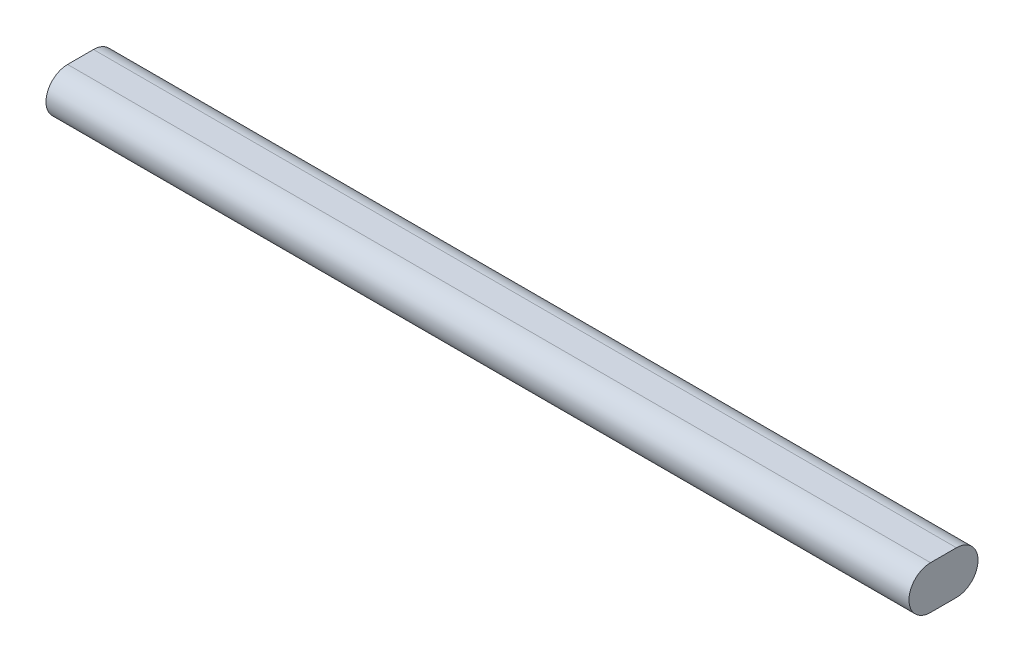
ISO-10303-21;
HEADER;
FILE_DESCRIPTION(('STEP AP214'),'2;1');
FILE_NAME('part.step','',(''),(''),'','','');
FILE_SCHEMA(('AUTOMOTIVE_DESIGN { 1 0 10303 214 1 1 1 1 }'));
ENDSEC;
DATA;
#1=APPLICATION_CONTEXT('core data for automotive mechanical design processes');
#2=APPLICATION_PROTOCOL_DEFINITION('international standard','automotive_design',2000,#1);
#3=PRODUCT_CONTEXT('',#1,'mechanical');
#4=PRODUCT('Part','Part','',(#3));
#5=PRODUCT_RELATED_PRODUCT_CATEGORY('part','',(#4));
#6=PRODUCT_DEFINITION_FORMATION('','',#4);
#7=PRODUCT_DEFINITION_CONTEXT('part definition',#1,'design');
#8=PRODUCT_DEFINITION('design','',#6,#7);
#9=PRODUCT_DEFINITION_SHAPE('','',#8);
#10=(LENGTH_UNIT() NAMED_UNIT(*) SI_UNIT(.MILLI.,.METRE.));
#11=(NAMED_UNIT(*) PLANE_ANGLE_UNIT() SI_UNIT($,.RADIAN.));
#12=(NAMED_UNIT(*) SI_UNIT($,.STERADIAN.) SOLID_ANGLE_UNIT());
#13=UNCERTAINTY_MEASURE_WITH_UNIT(LENGTH_MEASURE(1.E-05),#10,'distance_accuracy_value','');
#14=(GEOMETRIC_REPRESENTATION_CONTEXT(3) GLOBAL_UNCERTAINTY_ASSIGNED_CONTEXT((#13)) GLOBAL_UNIT_ASSIGNED_CONTEXT((#10,
#11,#12)) REPRESENTATION_CONTEXT('',''));
#15=CARTESIAN_POINT('',(0.,0.,0.));
#16=DIRECTION('',(0.,0.,1.));
#17=DIRECTION('',(1.,0.,0.));
#18=AXIS2_PLACEMENT_3D('',#15,#16,#17);
#19=CARTESIAN_POINT('',(500.,0.,0.));
#20=DIRECTION('',(-1.,0.,0.));
#21=DIRECTION('',(0.,0.,1.));
#22=AXIS2_PLACEMENT_3D('',#19,#20,#21);
#23=CYLINDRICAL_SURFACE('',#22,12.5);
#24=CARTESIAN_POINT('',(0.,0.,0.));
#25=DIRECTION('',(1.,0.,0.));
#26=DIRECTION('',(0.,0.,-1.));
#27=AXIS2_PLACEMENT_3D('',#24,#25,#26);
#28=CIRCLE('',#27,12.5);
#29=CARTESIAN_POINT('',(0.,12.5,0.));
#30=VERTEX_POINT('',#29);
#31=CARTESIAN_POINT('',(0.,-12.5,0.));
#32=VERTEX_POINT('',#31);
#33=EDGE_CURVE('E107',#30,#32,#28,.T.);
#34=ORIENTED_EDGE('',*,*,#33,.T.);
#35=DIRECTION('',(-1.,0.,0.));
#36=VECTOR('',#35,1.);
#37=CARTESIAN_POINT('',(500.,-12.5,0.));
#38=LINE('',#37,#36);
#39=CARTESIAN_POINT('',(500.,-12.5,0.));
#40=VERTEX_POINT('',#39);
#41=EDGE_CURVE('E11',#40,#32,#38,.T.);
#42=ORIENTED_EDGE('',*,*,#41,.F.);
#43=CARTESIAN_POINT('',(500.,0.,0.));
#44=DIRECTION('',(1.,0.,0.));
#45=DIRECTION('',(0.,0.,-1.));
#46=AXIS2_PLACEMENT_3D('',#43,#44,#45);
#47=CIRCLE('',#46,12.5);
#48=CARTESIAN_POINT('',(500.,12.5,0.));
#49=VERTEX_POINT('',#48);
#50=EDGE_CURVE('E91',#49,#40,#47,.T.);
#51=ORIENTED_EDGE('',*,*,#50,.F.);
#52=DIRECTION('',(-1.,0.,0.));
#53=VECTOR('',#52,1.);
#54=CARTESIAN_POINT('',(500.,12.5,0.));
#55=LINE('',#54,#53);
#56=EDGE_CURVE('E103',#49,#30,#55,.T.);
#57=ORIENTED_EDGE('',*,*,#56,.T.);
#58=EDGE_LOOP('',(#34,#42,#51,#57));
#59=FACE_BOUND('',#58,.T.);
#60=ADVANCED_FACE('F39',(#59),#23,.T.);
#61=CARTESIAN_POINT('',(500.,-12.5,0.));
#62=DIRECTION('',(0.,1.,0.));
#63=DIRECTION('',(0.,0.,1.));
#64=AXIS2_PLACEMENT_3D('',#61,#62,#63);
#65=PLANE('',#64);
#66=DIRECTION('',(0.,0.,-1.));
#67=VECTOR('',#66,1.);
#68=CARTESIAN_POINT('',(0.,-12.5,0.));
#69=LINE('',#68,#67);
#70=CARTESIAN_POINT('',(0.,-12.5,-15.));
#71=VERTEX_POINT('',#70);
#72=EDGE_CURVE('E96',#32,#71,#69,.T.);
#73=ORIENTED_EDGE('',*,*,#72,.T.);
#74=DIRECTION('',(-1.,0.,0.));
#75=VECTOR('',#74,1.);
#76=CARTESIAN_POINT('',(500.,-12.5,-15.));
#77=LINE('',#76,#75);
#78=CARTESIAN_POINT('',(500.,-12.5,-15.));
#79=VERTEX_POINT('',#78);
#80=EDGE_CURVE('E48',#79,#71,#77,.T.);
#81=ORIENTED_EDGE('',*,*,#80,.F.);
#82=DIRECTION('',(0.,0.,-1.));
#83=VECTOR('',#82,1.);
#84=CARTESIAN_POINT('',(500.,-12.5,0.));
#85=LINE('',#84,#83);
#86=EDGE_CURVE('E86',#40,#79,#85,.T.);
#87=ORIENTED_EDGE('',*,*,#86,.F.);
#88=ORIENTED_EDGE('',*,*,#41,.T.);
#89=EDGE_LOOP('',(#73,#81,#87,#88));
#90=FACE_BOUND('',#89,.T.);
#91=ADVANCED_FACE('F95',(#90),#65,.F.);
#92=CARTESIAN_POINT('',(500.,0.,-15.));
#93=DIRECTION('',(-1.,0.,0.));
#94=DIRECTION('',(0.,0.,1.));
#95=AXIS2_PLACEMENT_3D('',#92,#93,#94);
#96=CYLINDRICAL_SURFACE('',#95,12.5);
#97=CARTESIAN_POINT('',(0.,0.,-15.));
#98=DIRECTION('',(1.,0.,0.));
#99=DIRECTION('',(0.,0.,-1.));
#100=AXIS2_PLACEMENT_3D('',#97,#98,#99);
#101=CIRCLE('',#100,12.5);
#102=CARTESIAN_POINT('',(0.,12.5,-15.));
#103=VERTEX_POINT('',#102);
#104=EDGE_CURVE('E73',#71,#103,#101,.T.);
#105=ORIENTED_EDGE('',*,*,#104,.T.);
#106=DIRECTION('',(-1.,0.,0.));
#107=VECTOR('',#106,1.);
#108=CARTESIAN_POINT('',(500.,12.5,-15.));
#109=LINE('',#108,#107);
#110=CARTESIAN_POINT('',(500.,12.5,-15.));
#111=VERTEX_POINT('',#110);
#112=EDGE_CURVE('E98',#111,#103,#109,.T.);
#113=ORIENTED_EDGE('',*,*,#112,.F.);
#114=CARTESIAN_POINT('',(500.,0.,-15.));
#115=DIRECTION('',(1.,0.,0.));
#116=DIRECTION('',(0.,0.,-1.));
#117=AXIS2_PLACEMENT_3D('',#114,#115,#116);
#118=CIRCLE('',#117,12.5);
#119=EDGE_CURVE('E89',#79,#111,#118,.T.);
#120=ORIENTED_EDGE('',*,*,#119,.F.);
#121=ORIENTED_EDGE('',*,*,#80,.T.);
#122=EDGE_LOOP('',(#105,#113,#120,#121));
#123=FACE_BOUND('',#122,.T.);
#124=ADVANCED_FACE('F99',(#123),#96,.T.);
#125=CARTESIAN_POINT('',(500.,12.5,0.));
#126=DIRECTION('',(0.,-1.,0.));
#127=DIRECTION('',(0.,0.,-1.));
#128=AXIS2_PLACEMENT_3D('',#125,#126,#127);
#129=PLANE('',#128);
#130=DIRECTION('',(0.,0.,1.));
#131=VECTOR('',#130,1.);
#132=CARTESIAN_POINT('',(0.,12.5,0.));
#133=LINE('',#132,#131);
#134=EDGE_CURVE('E79',#103,#30,#133,.T.);
#135=ORIENTED_EDGE('',*,*,#134,.T.);
#136=ORIENTED_EDGE('',*,*,#56,.F.);
#137=DIRECTION('',(0.,0.,1.));
#138=VECTOR('',#137,1.);
#139=CARTESIAN_POINT('',(500.,12.5,0.));
#140=LINE('',#139,#138);
#141=EDGE_CURVE('E56',#111,#49,#140,.T.);
#142=ORIENTED_EDGE('',*,*,#141,.F.);
#143=ORIENTED_EDGE('',*,*,#112,.T.);
#144=EDGE_LOOP('',(#135,#136,#142,#143));
#145=FACE_BOUND('',#144,.T.);
#146=ADVANCED_FACE('F120',(#145),#129,.F.);
#147=CARTESIAN_POINT('',(500.,0.,0.));
#148=DIRECTION('',(1.,0.,0.));
#149=DIRECTION('',(0.,0.,-1.));
#150=AXIS2_PLACEMENT_3D('',#147,#148,#149);
#151=PLANE('',#150);
#152=ORIENTED_EDGE('',*,*,#50,.T.);
#153=ORIENTED_EDGE('',*,*,#86,.T.);
#154=ORIENTED_EDGE('',*,*,#119,.T.);
#155=ORIENTED_EDGE('',*,*,#141,.T.);
#156=EDGE_LOOP('',(#152,#153,#154,#155));
#157=FACE_BOUND('',#156,.T.);
#158=ADVANCED_FACE('F87',(#157),#151,.T.);
#159=CARTESIAN_POINT('',(0.,0.,0.));
#160=DIRECTION('',(1.,0.,0.));
#161=DIRECTION('',(0.,0.,-1.));
#162=AXIS2_PLACEMENT_3D('',#159,#160,#161);
#163=PLANE('',#162);
#164=ORIENTED_EDGE('',*,*,#33,.F.);
#165=ORIENTED_EDGE('',*,*,#134,.F.);
#166=ORIENTED_EDGE('',*,*,#104,.F.);
#167=ORIENTED_EDGE('',*,*,#72,.F.);
#168=EDGE_LOOP('',(#164,#165,#166,#167));
#169=FACE_BOUND('',#168,.T.);
#170=ADVANCED_FACE('F123',(#169),#163,.F.);
#171=CLOSED_SHELL('',(#60,#91,#124,#146,#158,#170));
#172=MANIFOLD_SOLID_BREP('B2',#171);
#173=ADVANCED_BREP_SHAPE_REPRESENTATION('',(#18,#172),#14);
#174=SHAPE_DEFINITION_REPRESENTATION(#9,#173);
ENDSEC;
END-ISO-10303-21;
